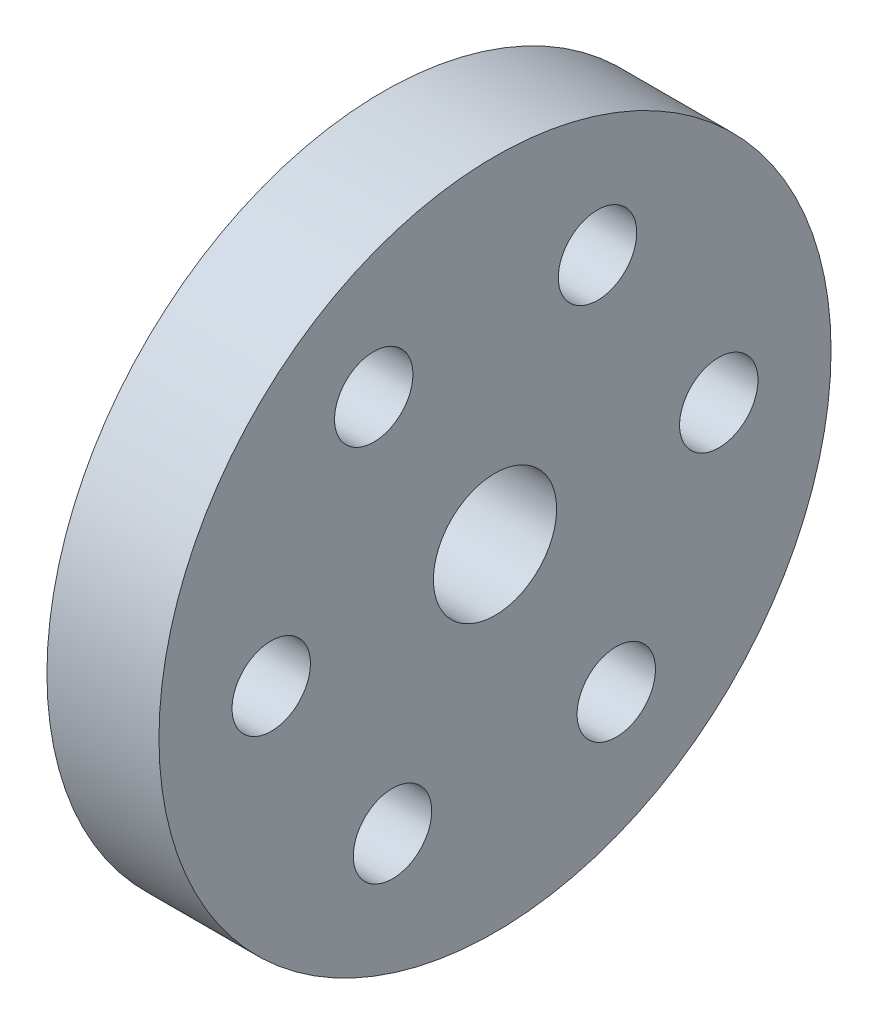
ISO-10303-21;
HEADER;
FILE_DESCRIPTION(('STEP AP214'),'2;1');
FILE_NAME('part.step','',(''),(''),'','','');
FILE_SCHEMA(('AUTOMOTIVE_DESIGN { 1 0 10303 214 1 1 1 1 }'));
ENDSEC;
DATA;
#1=APPLICATION_CONTEXT('core data for automotive mechanical design processes');
#2=APPLICATION_PROTOCOL_DEFINITION('international standard','automotive_design',2000,#1);
#3=PRODUCT_CONTEXT('',#1,'mechanical');
#4=PRODUCT('Part','Part','',(#3));
#5=PRODUCT_RELATED_PRODUCT_CATEGORY('part','',(#4));
#6=PRODUCT_DEFINITION_FORMATION('','',#4);
#7=PRODUCT_DEFINITION_CONTEXT('part definition',#1,'design');
#8=PRODUCT_DEFINITION('design','',#6,#7);
#9=PRODUCT_DEFINITION_SHAPE('','',#8);
#10=(LENGTH_UNIT() NAMED_UNIT(*) SI_UNIT(.MILLI.,.METRE.));
#11=(NAMED_UNIT(*) PLANE_ANGLE_UNIT() SI_UNIT($,.RADIAN.));
#12=(NAMED_UNIT(*) SI_UNIT($,.STERADIAN.) SOLID_ANGLE_UNIT());
#13=UNCERTAINTY_MEASURE_WITH_UNIT(LENGTH_MEASURE(1.E-05),#10,'distance_accuracy_value','');
#14=(GEOMETRIC_REPRESENTATION_CONTEXT(3) GLOBAL_UNCERTAINTY_ASSIGNED_CONTEXT((#13)) GLOBAL_UNIT_ASSIGNED_CONTEXT((#10,
#11,#12)) REPRESENTATION_CONTEXT('',''));
#15=CARTESIAN_POINT('',(0.,0.,0.));
#16=DIRECTION('',(0.,0.,1.));
#17=DIRECTION('',(1.,0.,0.));
#18=AXIS2_PLACEMENT_3D('',#15,#16,#17);
#19=CARTESIAN_POINT('',(5.,0.,0.));
#20=DIRECTION('',(1.,0.,0.));
#21=DIRECTION('',(0.,0.,-1.));
#22=AXIS2_PLACEMENT_3D('',#19,#20,#21);
#23=PLANE('',#22);
#24=CARTESIAN_POINT('',(5.,0.483389028949878,-9.98830991943539));
#25=DIRECTION('',(1.,0.,0.));
#26=DIRECTION('',(0.,0.,-1.));
#27=AXIS2_PLACEMENT_3D('',#24,#25,#26);
#28=CIRCLE('',#27,1.74999999999998);
#29=CARTESIAN_POINT('',(5.,0.483389028949878,-11.7383099194354));
#30=VERTEX_POINT('',#29);
#31=EDGE_CURVE('E93',#30,#30,#28,.T.);
#32=ORIENTED_EDGE('',*,*,#31,.F.);
#33=EDGE_LOOP('',(#32));
#34=FACE_BOUND('',#33,.T.);
#35=CARTESIAN_POINT('',(5.,8.89182464557806,-4.5755277807365));
#36=DIRECTION('',(1.,0.,0.));
#37=DIRECTION('',(0.,0.,-1.));
#38=AXIS2_PLACEMENT_3D('',#35,#36,#37);
#39=CIRCLE('',#38,1.75000000000007);
#40=CARTESIAN_POINT('',(5.,8.89182464557806,-6.32552778073657));
#41=VERTEX_POINT('',#40);
#42=EDGE_CURVE('E94',#41,#41,#39,.T.);
#43=ORIENTED_EDGE('',*,*,#42,.F.);
#44=EDGE_LOOP('',(#43));
#45=FACE_BOUND('',#44,.T.);
#46=CARTESIAN_POINT('',(5.,8.40843561662821,5.41278213869889));
#47=DIRECTION('',(1.,0.,0.));
#48=DIRECTION('',(0.,0.,-1.));
#49=AXIS2_PLACEMENT_3D('',#46,#47,#48);
#50=CIRCLE('',#49,1.74999999999998);
#51=CARTESIAN_POINT('',(5.,8.40843561662821,3.66278213869891));
#52=VERTEX_POINT('',#51);
#53=EDGE_CURVE('E60',#52,#52,#50,.T.);
#54=ORIENTED_EDGE('',*,*,#53,.F.);
#55=EDGE_LOOP('',(#54));
#56=FACE_BOUND('',#55,.T.);
#57=CARTESIAN_POINT('',(5.,-0.483389028949885,9.98830991943539));
#58=DIRECTION('',(1.,0.,0.));
#59=DIRECTION('',(0.,0.,-1.));
#60=AXIS2_PLACEMENT_3D('',#57,#58,#59);
#61=CIRCLE('',#60,1.75000000000002);
#62=CARTESIAN_POINT('',(5.,-0.483389028949885,8.23830991943537));
#63=VERTEX_POINT('',#62);
#64=EDGE_CURVE('E69',#63,#63,#61,.T.);
#65=ORIENTED_EDGE('',*,*,#64,.F.);
#66=EDGE_LOOP('',(#65));
#67=FACE_BOUND('',#66,.T.);
#68=CARTESIAN_POINT('',(5.,-8.89182464557801,4.5755277807365));
#69=DIRECTION('',(1.,0.,0.));
#70=DIRECTION('',(0.,0.,-1.));
#71=AXIS2_PLACEMENT_3D('',#68,#69,#70);
#72=CIRCLE('',#71,1.74999999999997);
#73=CARTESIAN_POINT('',(5.,-8.89182464557801,2.82552778073652));
#74=VERTEX_POINT('',#73);
#75=EDGE_CURVE('E77',#74,#74,#72,.T.);
#76=ORIENTED_EDGE('',*,*,#75,.F.);
#77=EDGE_LOOP('',(#76));
#78=FACE_BOUND('',#77,.T.);
#79=CARTESIAN_POINT('',(5.,-8.40843561662823,-5.41278213869892));
#80=DIRECTION('',(1.,0.,0.));
#81=DIRECTION('',(0.,0.,-1.));
#82=AXIS2_PLACEMENT_3D('',#79,#80,#81);
#83=CIRCLE('',#82,1.74999999999921);
#84=CARTESIAN_POINT('',(5.,-8.40843561662823,-7.16278213869812));
#85=VERTEX_POINT('',#84);
#86=EDGE_CURVE('E85',#85,#85,#83,.T.);
#87=ORIENTED_EDGE('',*,*,#86,.F.);
#88=EDGE_LOOP('',(#87));
#89=FACE_BOUND('',#88,.T.);
#90=CARTESIAN_POINT('',(5.,0.,0.));
#91=DIRECTION('',(1.,0.,0.));
#92=DIRECTION('',(0.,0.,-1.));
#93=AXIS2_PLACEMENT_3D('',#90,#91,#92);
#94=CIRCLE('',#93,15.);
#95=CARTESIAN_POINT('',(5.,0.,-15.));
#96=VERTEX_POINT('',#95);
#97=EDGE_CURVE('E10',#96,#96,#94,.T.);
#98=ORIENTED_EDGE('',*,*,#97,.T.);
#99=EDGE_LOOP('',(#98));
#100=FACE_BOUND('',#99,.T.);
#101=CARTESIAN_POINT('',(5.,0.,0.));
#102=DIRECTION('',(1.,0.,0.));
#103=DIRECTION('',(0.,0.,-1.));
#104=AXIS2_PLACEMENT_3D('',#101,#102,#103);
#105=CIRCLE('',#104,2.75);
#106=CARTESIAN_POINT('',(5.,0.,-2.75));
#107=VERTEX_POINT('',#106);
#108=EDGE_CURVE('E50',#107,#107,#105,.T.);
#109=ORIENTED_EDGE('',*,*,#108,.F.);
#110=EDGE_LOOP('',(#109));
#111=FACE_BOUND('',#110,.T.);
#112=ADVANCED_FACE('F37',(#34,#45,#56,#67,#78,#89,#100,#111),#23,.T.);
#113=CARTESIAN_POINT('',(0.,0.,0.));
#114=DIRECTION('',(1.,0.,0.));
#115=DIRECTION('',(0.,0.,-1.));
#116=AXIS2_PLACEMENT_3D('',#113,#114,#115);
#117=PLANE('',#116);
#118=CARTESIAN_POINT('',(0.,0.483389028949878,-9.98830991943539));
#119=DIRECTION('',(1.,0.,0.));
#120=DIRECTION('',(0.,0.,-1.));
#121=AXIS2_PLACEMENT_3D('',#118,#119,#120);
#122=CIRCLE('',#121,1.74999999999998);
#123=CARTESIAN_POINT('',(0.,0.483389028949878,-11.7383099194354));
#124=VERTEX_POINT('',#123);
#125=EDGE_CURVE('E56',#124,#124,#122,.T.);
#126=ORIENTED_EDGE('',*,*,#125,.T.);
#127=EDGE_LOOP('',(#126));
#128=FACE_BOUND('',#127,.T.);
#129=CARTESIAN_POINT('',(0.,8.89182464557806,-4.5755277807365));
#130=DIRECTION('',(1.,0.,0.));
#131=DIRECTION('',(0.,0.,-1.));
#132=AXIS2_PLACEMENT_3D('',#129,#130,#131);
#133=CIRCLE('',#132,1.75000000000007);
#134=CARTESIAN_POINT('',(0.,8.89182464557806,-6.32552778073657));
#135=VERTEX_POINT('',#134);
#136=EDGE_CURVE('E65',#135,#135,#133,.T.);
#137=ORIENTED_EDGE('',*,*,#136,.T.);
#138=EDGE_LOOP('',(#137));
#139=FACE_BOUND('',#138,.T.);
#140=CARTESIAN_POINT('',(0.,8.40843561662821,5.41278213869889));
#141=DIRECTION('',(1.,0.,0.));
#142=DIRECTION('',(0.,0.,-1.));
#143=AXIS2_PLACEMENT_3D('',#140,#141,#142);
#144=CIRCLE('',#143,1.74999999999998);
#145=CARTESIAN_POINT('',(0.,8.40843561662821,3.66278213869891));
#146=VERTEX_POINT('',#145);
#147=EDGE_CURVE('E64',#146,#146,#144,.T.);
#148=ORIENTED_EDGE('',*,*,#147,.T.);
#149=EDGE_LOOP('',(#148));
#150=FACE_BOUND('',#149,.T.);
#151=CARTESIAN_POINT('',(0.,-0.483389028949885,9.98830991943539));
#152=DIRECTION('',(1.,0.,0.));
#153=DIRECTION('',(0.,0.,-1.));
#154=AXIS2_PLACEMENT_3D('',#151,#152,#153);
#155=CIRCLE('',#154,1.75000000000002);
#156=CARTESIAN_POINT('',(0.,-0.483389028949885,8.23830991943537));
#157=VERTEX_POINT('',#156);
#158=EDGE_CURVE('E73',#157,#157,#155,.T.);
#159=ORIENTED_EDGE('',*,*,#158,.T.);
#160=EDGE_LOOP('',(#159));
#161=FACE_BOUND('',#160,.T.);
#162=CARTESIAN_POINT('',(0.,-8.89182464557801,4.5755277807365));
#163=DIRECTION('',(1.,0.,0.));
#164=DIRECTION('',(0.,0.,-1.));
#165=AXIS2_PLACEMENT_3D('',#162,#163,#164);
#166=CIRCLE('',#165,1.74999999999997);
#167=CARTESIAN_POINT('',(0.,-8.89182464557801,2.82552778073652));
#168=VERTEX_POINT('',#167);
#169=EDGE_CURVE('E81',#168,#168,#166,.T.);
#170=ORIENTED_EDGE('',*,*,#169,.T.);
#171=EDGE_LOOP('',(#170));
#172=FACE_BOUND('',#171,.T.);
#173=CARTESIAN_POINT('',(0.,-8.40843561662823,-5.41278213869892));
#174=DIRECTION('',(1.,0.,0.));
#175=DIRECTION('',(0.,0.,-1.));
#176=AXIS2_PLACEMENT_3D('',#173,#174,#175);
#177=CIRCLE('',#176,1.74999999999921);
#178=CARTESIAN_POINT('',(0.,-8.40843561662823,-7.16278213869812));
#179=VERTEX_POINT('',#178);
#180=EDGE_CURVE('E89',#179,#179,#177,.T.);
#181=ORIENTED_EDGE('',*,*,#180,.T.);
#182=EDGE_LOOP('',(#181));
#183=FACE_BOUND('',#182,.T.);
#184=CARTESIAN_POINT('',(0.,0.,0.));
#185=DIRECTION('',(1.,0.,0.));
#186=DIRECTION('',(0.,0.,-1.));
#187=AXIS2_PLACEMENT_3D('',#184,#185,#186);
#188=CIRCLE('',#187,15.);
#189=CARTESIAN_POINT('',(0.,0.,-15.));
#190=VERTEX_POINT('',#189);
#191=EDGE_CURVE('E41',#190,#190,#188,.T.);
#192=ORIENTED_EDGE('',*,*,#191,.F.);
#193=EDGE_LOOP('',(#192));
#194=FACE_BOUND('',#193,.T.);
#195=CARTESIAN_POINT('',(0.,0.,0.));
#196=DIRECTION('',(1.,0.,0.));
#197=DIRECTION('',(0.,0.,-1.));
#198=AXIS2_PLACEMENT_3D('',#195,#196,#197);
#199=CIRCLE('',#198,2.75);
#200=CARTESIAN_POINT('',(0.,0.,-2.75));
#201=VERTEX_POINT('',#200);
#202=EDGE_CURVE('E52',#201,#201,#199,.T.);
#203=ORIENTED_EDGE('',*,*,#202,.T.);
#204=EDGE_LOOP('',(#203));
#205=FACE_BOUND('',#204,.T.);
#206=ADVANCED_FACE('F108',(#128,#139,#150,#161,#172,#183,#194,#205),#117,.F.);
#207=CARTESIAN_POINT('',(5.,0.,0.));
#208=DIRECTION('',(-1.,0.,0.));
#209=DIRECTION('',(0.,0.,1.));
#210=AXIS2_PLACEMENT_3D('',#207,#208,#209);
#211=CYLINDRICAL_SURFACE('',#210,15.);
#212=ORIENTED_EDGE('',*,*,#97,.F.);
#213=EDGE_LOOP('',(#212));
#214=FACE_BOUND('',#213,.T.);
#215=ORIENTED_EDGE('',*,*,#191,.T.);
#216=EDGE_LOOP('',(#215));
#217=FACE_BOUND('',#216,.T.);
#218=ADVANCED_FACE('F39',(#214,#217),#211,.T.);
#219=CARTESIAN_POINT('',(5.,0.,0.));
#220=DIRECTION('',(-1.,0.,0.));
#221=DIRECTION('',(0.,0.,1.));
#222=AXIS2_PLACEMENT_3D('',#219,#220,#221);
#223=CYLINDRICAL_SURFACE('',#222,2.75);
#224=ORIENTED_EDGE('',*,*,#108,.T.);
#225=EDGE_LOOP('',(#224));
#226=FACE_BOUND('',#225,.T.);
#227=ORIENTED_EDGE('',*,*,#202,.F.);
#228=EDGE_LOOP('',(#227));
#229=FACE_BOUND('',#228,.T.);
#230=ADVANCED_FACE('F133',(#226,#229),#223,.F.);
#231=CARTESIAN_POINT('',(0.,-8.40843561662823,-5.41278213869892));
#232=DIRECTION('',(1.,0.,0.));
#233=DIRECTION('',(0.,0.,-1.));
#234=AXIS2_PLACEMENT_3D('',#231,#232,#233);
#235=CYLINDRICAL_SURFACE('',#234,1.74999999999921);
#236=ORIENTED_EDGE('',*,*,#180,.F.);
#237=EDGE_LOOP('',(#236));
#238=FACE_BOUND('',#237,.T.);
#239=ORIENTED_EDGE('',*,*,#86,.T.);
#240=EDGE_LOOP('',(#239));
#241=FACE_BOUND('',#240,.T.);
#242=ADVANCED_FACE('F136',(#238,#241),#235,.F.);
#243=CARTESIAN_POINT('',(0.,-8.89182464557801,4.5755277807365));
#244=DIRECTION('',(1.,0.,0.));
#245=DIRECTION('',(0.,0.,-1.));
#246=AXIS2_PLACEMENT_3D('',#243,#244,#245);
#247=CYLINDRICAL_SURFACE('',#246,1.74999999999997);
#248=ORIENTED_EDGE('',*,*,#169,.F.);
#249=EDGE_LOOP('',(#248));
#250=FACE_BOUND('',#249,.T.);
#251=ORIENTED_EDGE('',*,*,#75,.T.);
#252=EDGE_LOOP('',(#251));
#253=FACE_BOUND('',#252,.T.);
#254=ADVANCED_FACE('F153',(#250,#253),#247,.F.);
#255=CARTESIAN_POINT('',(0.,-0.483389028949885,9.98830991943539));
#256=DIRECTION('',(1.,0.,0.));
#257=DIRECTION('',(0.,0.,-1.));
#258=AXIS2_PLACEMENT_3D('',#255,#256,#257);
#259=CYLINDRICAL_SURFACE('',#258,1.75000000000002);
#260=ORIENTED_EDGE('',*,*,#158,.F.);
#261=EDGE_LOOP('',(#260));
#262=FACE_BOUND('',#261,.T.);
#263=ORIENTED_EDGE('',*,*,#64,.T.);
#264=EDGE_LOOP('',(#263));
#265=FACE_BOUND('',#264,.T.);
#266=ADVANCED_FACE('F149',(#262,#265),#259,.F.);
#267=CARTESIAN_POINT('',(0.,8.40843561662821,5.41278213869889));
#268=DIRECTION('',(1.,0.,0.));
#269=DIRECTION('',(0.,0.,-1.));
#270=AXIS2_PLACEMENT_3D('',#267,#268,#269);
#271=CYLINDRICAL_SURFACE('',#270,1.74999999999998);
#272=ORIENTED_EDGE('',*,*,#147,.F.);
#273=EDGE_LOOP('',(#272));
#274=FACE_BOUND('',#273,.T.);
#275=ORIENTED_EDGE('',*,*,#53,.T.);
#276=EDGE_LOOP('',(#275));
#277=FACE_BOUND('',#276,.T.);
#278=ADVANCED_FACE('F146',(#274,#277),#271,.F.);
#279=CARTESIAN_POINT('',(0.,8.89182464557806,-4.5755277807365));
#280=DIRECTION('',(1.,0.,0.));
#281=DIRECTION('',(0.,0.,-1.));
#282=AXIS2_PLACEMENT_3D('',#279,#280,#281);
#283=CYLINDRICAL_SURFACE('',#282,1.75000000000007);
#284=ORIENTED_EDGE('',*,*,#136,.F.);
#285=EDGE_LOOP('',(#284));
#286=FACE_BOUND('',#285,.T.);
#287=ORIENTED_EDGE('',*,*,#42,.T.);
#288=EDGE_LOOP('',(#287));
#289=FACE_BOUND('',#288,.T.);
#290=ADVANCED_FACE('F114',(#286,#289),#283,.F.);
#291=CARTESIAN_POINT('',(0.,0.483389028949878,-9.98830991943539));
#292=DIRECTION('',(1.,0.,0.));
#293=DIRECTION('',(0.,0.,-1.));
#294=AXIS2_PLACEMENT_3D('',#291,#292,#293);
#295=CYLINDRICAL_SURFACE('',#294,1.74999999999998);
#296=ORIENTED_EDGE('',*,*,#125,.F.);
#297=EDGE_LOOP('',(#296));
#298=FACE_BOUND('',#297,.T.);
#299=ORIENTED_EDGE('',*,*,#31,.T.);
#300=EDGE_LOOP('',(#299));
#301=FACE_BOUND('',#300,.T.);
#302=ADVANCED_FACE('F111',(#298,#301),#295,.F.);
#303=CLOSED_SHELL('',(#112,#206,#218,#230,#242,#254,#266,#278,#290,#302));
#304=MANIFOLD_SOLID_BREP('B2',#303);
#305=ADVANCED_BREP_SHAPE_REPRESENTATION('',(#18,#304),#14);
#306=SHAPE_DEFINITION_REPRESENTATION(#9,#305);
ENDSEC;
END-ISO-10303-21;
